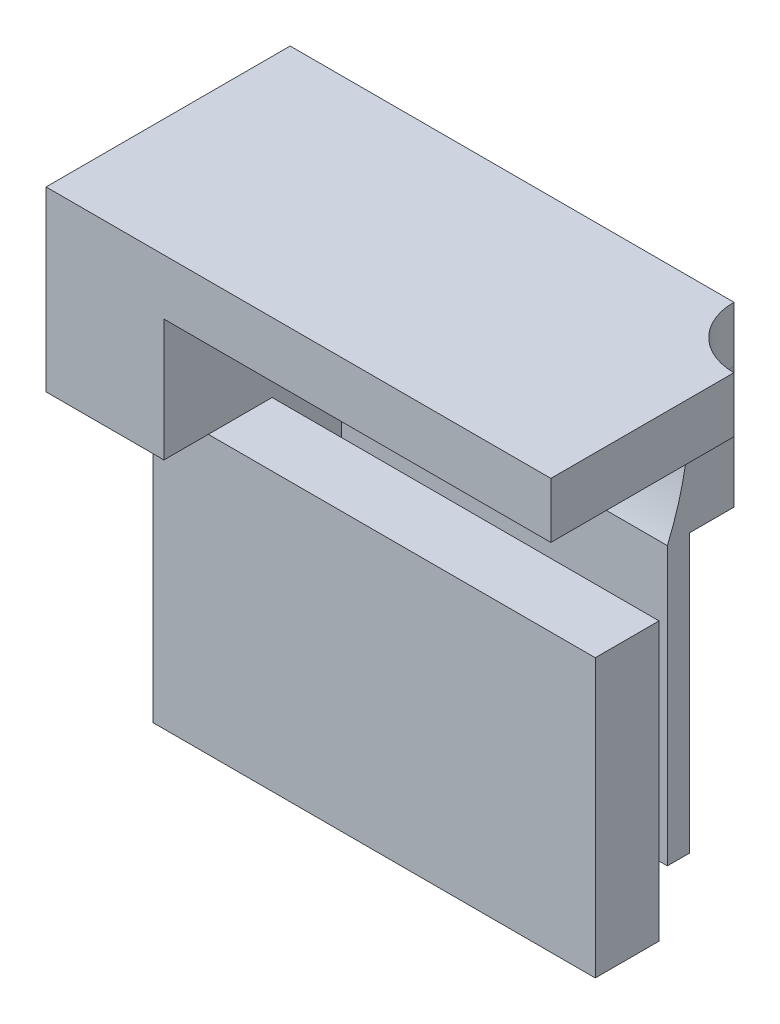
ISO-10303-21;
HEADER;
FILE_DESCRIPTION(('STEP AP214'),'2;1');
FILE_NAME('part.step','',(''),(''),'','','');
FILE_SCHEMA(('AUTOMOTIVE_DESIGN { 1 0 10303 214 1 1 1 1 }'));
ENDSEC;
DATA;
#1=APPLICATION_CONTEXT('core data for automotive mechanical design processes');
#2=APPLICATION_PROTOCOL_DEFINITION('international standard','automotive_design',2000,#1);
#3=PRODUCT_CONTEXT('',#1,'mechanical');
#4=PRODUCT('Part','Part','',(#3));
#5=PRODUCT_RELATED_PRODUCT_CATEGORY('part','',(#4));
#6=PRODUCT_DEFINITION_FORMATION('','',#4);
#7=PRODUCT_DEFINITION_CONTEXT('part definition',#1,'design');
#8=PRODUCT_DEFINITION('design','',#6,#7);
#9=PRODUCT_DEFINITION_SHAPE('','',#8);
#10=(LENGTH_UNIT() NAMED_UNIT(*) SI_UNIT(.MILLI.,.METRE.));
#11=(NAMED_UNIT(*) PLANE_ANGLE_UNIT() SI_UNIT($,.RADIAN.));
#12=(NAMED_UNIT(*) SI_UNIT($,.STERADIAN.) SOLID_ANGLE_UNIT());
#13=UNCERTAINTY_MEASURE_WITH_UNIT(LENGTH_MEASURE(1.E-05),#10,'distance_accuracy_value','');
#14=(GEOMETRIC_REPRESENTATION_CONTEXT(3) GLOBAL_UNCERTAINTY_ASSIGNED_CONTEXT((#13)) GLOBAL_UNIT_ASSIGNED_CONTEXT((#10,
#11,#12)) REPRESENTATION_CONTEXT('',''));
#15=CARTESIAN_POINT('',(0.,0.,0.));
#16=DIRECTION('',(0.,0.,1.));
#17=DIRECTION('',(1.,0.,0.));
#18=AXIS2_PLACEMENT_3D('',#15,#16,#17);
#19=CARTESIAN_POINT('',(-25.4088697452663,0.,-4.39999999999999));
#20=DIRECTION('',(0.,1.,0.));
#21=DIRECTION('',(0.,0.,1.));
#22=AXIS2_PLACEMENT_3D('',#19,#20,#21);
#23=PLANE('',#22);
#24=DIRECTION('',(0.,0.,1.));
#25=VECTOR('',#24,1.);
#26=CARTESIAN_POINT('',(-27.6088697452663,0.,0.));
#27=LINE('',#26,#25);
#28=CARTESIAN_POINT('',(-27.6088697452663,0.,-4.39999999999999));
#29=VERTEX_POINT('',#28);
#30=CARTESIAN_POINT('',(-27.6088697452663,0.,-2.79999999999999));
#31=VERTEX_POINT('',#30);
#32=EDGE_CURVE('E234',#29,#31,#27,.T.);
#33=ORIENTED_EDGE('',*,*,#32,.F.);
#34=CARTESIAN_POINT('',(-25.4088697452663,0.,-4.39999999999999));
#35=DIRECTION('',(0.,-1.,0.));
#36=DIRECTION('',(0.,0.,1.));
#37=AXIS2_PLACEMENT_3D('',#34,#35,#36);
#38=CIRCLE('',#37,2.20000000000001);
#39=CARTESIAN_POINT('',(-25.4088697452663,0.,-2.19999999999999));
#40=VERTEX_POINT('',#39);
#41=EDGE_CURVE('E261',#40,#29,#38,.T.);
#42=ORIENTED_EDGE('',*,*,#41,.F.);
#43=DIRECTION('',(0.,0.,-1.));
#44=VECTOR('',#43,1.);
#45=CARTESIAN_POINT('',(-25.4088697452663,0.,-2.19999999999999));
#46=LINE('',#45,#44);
#47=CARTESIAN_POINT('',(-25.4088697452663,0.,4.4));
#48=VERTEX_POINT('',#47);
#49=EDGE_CURVE('E271',#48,#40,#46,.T.);
#50=ORIENTED_EDGE('',*,*,#49,.F.);
#51=DIRECTION('',(1.,0.,0.));
#52=VECTOR('',#51,1.);
#53=CARTESIAN_POINT('',(-43.6088697452663,0.,4.4));
#54=LINE('',#53,#52);
#55=CARTESIAN_POINT('',(-39.3588697452663,0.,4.4));
#56=VERTEX_POINT('',#55);
#57=EDGE_CURVE('E256',#56,#48,#54,.T.);
#58=ORIENTED_EDGE('',*,*,#57,.F.);
#59=DIRECTION('',(0.,0.,1.));
#60=VECTOR('',#59,1.);
#61=CARTESIAN_POINT('',(-39.3588697452663,0.,0.));
#62=LINE('',#61,#60);
#63=CARTESIAN_POINT('',(-39.3588697452663,0.,-2.8));
#64=VERTEX_POINT('',#63);
#65=EDGE_CURVE('E243',#64,#56,#62,.T.);
#66=ORIENTED_EDGE('',*,*,#65,.F.);
#67=DIRECTION('',(-1.,0.,0.));
#68=VECTOR('',#67,1.);
#69=CARTESIAN_POINT('',(0.,0.,-2.79999999999999));
#70=LINE('',#69,#68);
#71=EDGE_CURVE('E230',#31,#64,#70,.T.);
#72=ORIENTED_EDGE('',*,*,#71,.F.);
#73=EDGE_LOOP('',(#33,#42,#50,#58,#66,#72));
#74=FACE_BOUND('',#73,.T.);
#75=ADVANCED_FACE('F39',(#74),#23,.F.);
#76=CARTESIAN_POINT('',(-43.6088697452663,2.,-4.39999999999999));
#77=DIRECTION('',(1.,0.,0.));
#78=DIRECTION('',(0.,0.,-1.));
#79=AXIS2_PLACEMENT_3D('',#76,#77,#78);
#80=PLANE('',#79);
#81=DIRECTION('',(0.,-1.,0.));
#82=VECTOR('',#81,1.);
#83=CARTESIAN_POINT('',(-43.6088697452663,2.,-4.39999999999999));
#84=LINE('',#83,#82);
#85=CARTESIAN_POINT('',(-43.6088697452663,2.,-4.39999999999999));
#86=VERTEX_POINT('',#85);
#87=CARTESIAN_POINT('',(-43.6088697452663,-4.4,-4.39999999999999));
#88=VERTEX_POINT('',#87);
#89=EDGE_CURVE('E269',#86,#88,#84,.T.);
#90=ORIENTED_EDGE('',*,*,#89,.T.);
#91=DIRECTION('',(0.,0.,-1.));
#92=VECTOR('',#91,1.);
#93=CARTESIAN_POINT('',(-43.6088697452663,-4.4,0.));
#94=LINE('',#93,#92);
#95=CARTESIAN_POINT('',(-43.6088697452663,-4.4,4.4));
#96=VERTEX_POINT('',#95);
#97=EDGE_CURVE('E238',#96,#88,#94,.T.);
#98=ORIENTED_EDGE('',*,*,#97,.F.);
#99=DIRECTION('',(0.,-1.,0.));
#100=VECTOR('',#99,1.);
#101=CARTESIAN_POINT('',(-43.6088697452663,2.,4.4));
#102=LINE('',#101,#100);
#103=CARTESIAN_POINT('',(-43.6088697452663,2.,4.4));
#104=VERTEX_POINT('',#103);
#105=EDGE_CURVE('E285',#104,#96,#102,.T.);
#106=ORIENTED_EDGE('',*,*,#105,.F.);
#107=DIRECTION('',(0.,0.,1.));
#108=VECTOR('',#107,1.);
#109=CARTESIAN_POINT('',(-43.6088697452663,2.,-4.39999999999999));
#110=LINE('',#109,#108);
#111=EDGE_CURVE('E257',#86,#104,#110,.T.);
#112=ORIENTED_EDGE('',*,*,#111,.F.);
#113=EDGE_LOOP('',(#90,#98,#106,#112));
#114=FACE_BOUND('',#113,.T.);
#115=ADVANCED_FACE('F336',(#114),#80,.F.);
#116=CARTESIAN_POINT('',(-43.6088697452663,2.,4.4));
#117=DIRECTION('',(0.,0.,-1.));
#118=DIRECTION('',(-1.,0.,0.));
#119=AXIS2_PLACEMENT_3D('',#116,#117,#118);
#120=PLANE('',#119);
#121=ORIENTED_EDGE('',*,*,#105,.T.);
#122=DIRECTION('',(-1.,0.,0.));
#123=VECTOR('',#122,1.);
#124=CARTESIAN_POINT('',(0.,-4.4,4.4));
#125=LINE('',#124,#123);
#126=CARTESIAN_POINT('',(-39.3588697452663,-4.4,4.4));
#127=VERTEX_POINT('',#126);
#128=EDGE_CURVE('E235',#127,#96,#125,.T.);
#129=ORIENTED_EDGE('',*,*,#128,.F.);
#130=DIRECTION('',(0.,1.,0.));
#131=VECTOR('',#130,1.);
#132=CARTESIAN_POINT('',(-39.3588697452663,-4.4,4.4));
#133=LINE('',#132,#131);
#134=EDGE_CURVE('E251',#127,#56,#133,.T.);
#135=ORIENTED_EDGE('',*,*,#134,.T.);
#136=ORIENTED_EDGE('',*,*,#57,.T.);
#137=DIRECTION('',(0.,-1.,0.));
#138=VECTOR('',#137,1.);
#139=CARTESIAN_POINT('',(-25.4088697452663,2.,4.4));
#140=LINE('',#139,#138);
#141=CARTESIAN_POINT('',(-25.4088697452663,2.,4.4));
#142=VERTEX_POINT('',#141);
#143=EDGE_CURVE('E282',#142,#48,#140,.T.);
#144=ORIENTED_EDGE('',*,*,#143,.F.);
#145=DIRECTION('',(1.,0.,0.));
#146=VECTOR('',#145,1.);
#147=CARTESIAN_POINT('',(-43.6088697452663,2.,4.4));
#148=LINE('',#147,#146);
#149=EDGE_CURVE('E260',#104,#142,#148,.T.);
#150=ORIENTED_EDGE('',*,*,#149,.F.);
#151=EDGE_LOOP('',(#121,#129,#135,#136,#144,#150));
#152=FACE_BOUND('',#151,.T.);
#153=ADVANCED_FACE('F331',(#152),#120,.F.);
#154=CARTESIAN_POINT('',(-25.4088697452663,2.,-2.19999999999999));
#155=DIRECTION('',(-1.,0.,0.));
#156=DIRECTION('',(0.,0.,1.));
#157=AXIS2_PLACEMENT_3D('',#154,#155,#156);
#158=PLANE('',#157);
#159=ORIENTED_EDGE('',*,*,#49,.T.);
#160=DIRECTION('',(0.,-1.,0.));
#161=VECTOR('',#160,1.);
#162=CARTESIAN_POINT('',(-25.4088697452663,2.,-2.19999999999999));
#163=LINE('',#162,#161);
#164=CARTESIAN_POINT('',(-25.4088697452663,2.,-2.19999999999999));
#165=VERTEX_POINT('',#164);
#166=EDGE_CURVE('E279',#165,#40,#163,.T.);
#167=ORIENTED_EDGE('',*,*,#166,.F.);
#168=DIRECTION('',(0.,0.,-1.));
#169=VECTOR('',#168,1.);
#170=CARTESIAN_POINT('',(-25.4088697452663,2.,-2.19999999999999));
#171=LINE('',#170,#169);
#172=EDGE_CURVE('E263',#142,#165,#171,.T.);
#173=ORIENTED_EDGE('',*,*,#172,.F.);
#174=ORIENTED_EDGE('',*,*,#143,.T.);
#175=EDGE_LOOP('',(#159,#167,#173,#174));
#176=FACE_BOUND('',#175,.T.);
#177=ADVANCED_FACE('F348',(#176),#158,.F.);
#178=CARTESIAN_POINT('',(-25.4088697452663,2.,-4.39999999999999));
#179=DIRECTION('',(0.,-1.,0.));
#180=DIRECTION('',(0.,0.,-1.));
#181=AXIS2_PLACEMENT_3D('',#178,#179,#180);
#182=CYLINDRICAL_SURFACE('',#181,2.20000000000001);
#183=ORIENTED_EDGE('',*,*,#41,.T.);
#184=DIRECTION('',(0.,-1.,0.));
#185=VECTOR('',#184,1.);
#186=CARTESIAN_POINT('',(-27.6088697452663,2.,-4.39999999999999));
#187=LINE('',#186,#185);
#188=CARTESIAN_POINT('',(-27.6088697452663,2.,-4.39999999999999));
#189=VERTEX_POINT('',#188);
#190=EDGE_CURVE('E276',#189,#29,#187,.T.);
#191=ORIENTED_EDGE('',*,*,#190,.F.);
#192=CARTESIAN_POINT('',(-25.4088697452663,2.,-4.39999999999999));
#193=DIRECTION('',(0.,-1.,0.));
#194=DIRECTION('',(0.,0.,1.));
#195=AXIS2_PLACEMENT_3D('',#192,#193,#194);
#196=CIRCLE('',#195,2.20000000000001);
#197=EDGE_CURVE('E265',#165,#189,#196,.T.);
#198=ORIENTED_EDGE('',*,*,#197,.F.);
#199=ORIENTED_EDGE('',*,*,#166,.T.);
#200=EDGE_LOOP('',(#183,#191,#198,#199));
#201=FACE_BOUND('',#200,.T.);
#202=ADVANCED_FACE('F345',(#201),#182,.F.);
#203=CARTESIAN_POINT('',(-43.6088697452663,2.,-4.39999999999999));
#204=DIRECTION('',(0.,0.,1.));
#205=DIRECTION('',(1.,0.,0.));
#206=AXIS2_PLACEMENT_3D('',#203,#204,#205);
#207=PLANE('',#206);
#208=ORIENTED_EDGE('',*,*,#190,.T.);
#209=DIRECTION('',(0.,1.,0.));
#210=VECTOR('',#209,1.);
#211=CARTESIAN_POINT('',(-27.6088697452663,-4.4,-4.39999999999999));
#212=LINE('',#211,#210);
#213=CARTESIAN_POINT('',(-27.6088697452663,-4.4,-4.39999999999999));
#214=VERTEX_POINT('',#213);
#215=EDGE_CURVE('E249',#214,#29,#212,.T.);
#216=ORIENTED_EDGE('',*,*,#215,.F.);
#217=DIRECTION('',(1.,0.,0.));
#218=VECTOR('',#217,1.);
#219=CARTESIAN_POINT('',(0.,-4.4,-4.39999999999999));
#220=LINE('',#219,#218);
#221=EDGE_CURVE('E164',#88,#214,#220,.T.);
#222=ORIENTED_EDGE('',*,*,#221,.F.);
#223=ORIENTED_EDGE('',*,*,#89,.F.);
#224=DIRECTION('',(-1.,0.,0.));
#225=VECTOR('',#224,1.);
#226=CARTESIAN_POINT('',(-43.6088697452663,2.,-4.39999999999999));
#227=LINE('',#226,#225);
#228=EDGE_CURVE('E267',#189,#86,#227,.T.);
#229=ORIENTED_EDGE('',*,*,#228,.F.);
#230=EDGE_LOOP('',(#208,#216,#222,#223,#229));
#231=FACE_BOUND('',#230,.T.);
#232=ADVANCED_FACE('F341',(#231),#207,.F.);
#233=CARTESIAN_POINT('',(-25.4088697452663,2.,-4.39999999999999));
#234=DIRECTION('',(0.,1.,0.));
#235=DIRECTION('',(0.,0.,1.));
#236=AXIS2_PLACEMENT_3D('',#233,#234,#235);
#237=PLANE('',#236);
#238=ORIENTED_EDGE('',*,*,#111,.T.);
#239=ORIENTED_EDGE('',*,*,#149,.T.);
#240=ORIENTED_EDGE('',*,*,#172,.T.);
#241=ORIENTED_EDGE('',*,*,#197,.T.);
#242=ORIENTED_EDGE('',*,*,#228,.T.);
#243=EDGE_LOOP('',(#238,#239,#240,#241,#242));
#244=FACE_BOUND('',#243,.T.);
#245=ADVANCED_FACE('F351',(#244),#237,.T.);
#246=CARTESIAN_POINT('',(0.,-4.4,-2.79999999999999));
#247=DIRECTION('',(0.,0.,-1.));
#248=DIRECTION('',(-1.,0.,0.));
#249=AXIS2_PLACEMENT_3D('',#246,#247,#248);
#250=PLANE('',#249);
#251=DIRECTION('',(0.,1.,0.));
#252=VECTOR('',#251,1.);
#253=CARTESIAN_POINT('',(-39.3588697452663,-4.4,-2.8));
#254=LINE('',#253,#252);
#255=CARTESIAN_POINT('',(-39.3588697452663,-0.480816411546927,-2.8));
#256=VERTEX_POINT('',#255);
#257=EDGE_CURVE('E254',#256,#64,#254,.T.);
#258=ORIENTED_EDGE('',*,*,#257,.F.);
#259=DIRECTION('',(1.,0.,0.));
#260=VECTOR('',#259,1.);
#261=CARTESIAN_POINT('',(0.,-0.480816411546927,-2.79999999999999));
#262=LINE('',#261,#260);
#263=CARTESIAN_POINT('',(-27.6088697452663,-0.480816411546927,-2.79999999999999));
#264=VERTEX_POINT('',#263);
#265=EDGE_CURVE('E47',#256,#264,#262,.T.);
#266=ORIENTED_EDGE('',*,*,#265,.T.);
#267=DIRECTION('',(0.,1.,0.));
#268=VECTOR('',#267,1.);
#269=CARTESIAN_POINT('',(-27.6088697452663,-4.4,-2.79999999999999));
#270=LINE('',#269,#268);
#271=EDGE_CURVE('E168',#264,#31,#270,.T.);
#272=ORIENTED_EDGE('',*,*,#271,.T.);
#273=ORIENTED_EDGE('',*,*,#71,.T.);
#274=EDGE_LOOP('',(#258,#266,#272,#273));
#275=FACE_BOUND('',#274,.T.);
#276=ADVANCED_FACE('F324',(#275),#250,.F.);
#277=CARTESIAN_POINT('',(-39.3588697452663,-4.4,0.));
#278=DIRECTION('',(-1.,0.,0.));
#279=DIRECTION('',(0.,0.,1.));
#280=AXIS2_PLACEMENT_3D('',#277,#278,#279);
#281=PLANE('',#280);
#282=DIRECTION('',(0.,1.,0.));
#283=VECTOR('',#282,1.);
#284=CARTESIAN_POINT('',(-39.3588697452663,-14.4,-2.));
#285=LINE('',#284,#283);
#286=CARTESIAN_POINT('',(-39.3588697452663,-14.4,-2.));
#287=VERTEX_POINT('',#286);
#288=CARTESIAN_POINT('',(-39.3588697452663,-4.4,-2.));
#289=VERTEX_POINT('',#288);
#290=EDGE_CURVE('E218',#287,#289,#285,.T.);
#291=ORIENTED_EDGE('',*,*,#290,.T.);
#292=CARTESIAN_POINT('',(-39.3588697452663,-0.480816411546927,7.20000000000001));
#293=DIRECTION('',(-1.,0.,0.));
#294=DIRECTION('',(0.,0.,1.));
#295=AXIS2_PLACEMENT_3D('',#292,#293,#294);
#296=CIRCLE('',#295,10.);
#297=EDGE_CURVE('E287',#289,#256,#296,.F.);
#298=ORIENTED_EDGE('',*,*,#297,.T.);
#299=ORIENTED_EDGE('',*,*,#257,.T.);
#300=ORIENTED_EDGE('',*,*,#65,.T.);
#301=ORIENTED_EDGE('',*,*,#134,.F.);
#302=DIRECTION('',(0.,0.,1.));
#303=VECTOR('',#302,1.);
#304=CARTESIAN_POINT('',(-39.3588697452663,-4.4,0.));
#305=LINE('',#304,#303);
#306=CARTESIAN_POINT('',(-39.3588697452663,-4.4,2.8));
#307=VERTEX_POINT('',#306);
#308=EDGE_CURVE('E231',#307,#127,#305,.T.);
#309=ORIENTED_EDGE('',*,*,#308,.F.);
#310=CARTESIAN_POINT('',(-39.3588697452663,-4.4,0.500000000000003));
#311=VERTEX_POINT('',#310);
#312=EDGE_CURVE('E233',#311,#307,#305,.T.);
#313=ORIENTED_EDGE('',*,*,#312,.F.);
#314=DIRECTION('',(0.,1.,0.));
#315=VECTOR('',#314,1.);
#316=CARTESIAN_POINT('',(-39.3588697452663,-14.4,0.500000000000003));
#317=LINE('',#316,#315);
#318=CARTESIAN_POINT('',(-39.3588697452663,-14.4,0.500000000000003));
#319=VERTEX_POINT('',#318);
#320=EDGE_CURVE('E215',#319,#311,#317,.T.);
#321=ORIENTED_EDGE('',*,*,#320,.F.);
#322=DIRECTION('',(0.,0.,1.));
#323=VECTOR('',#322,1.);
#324=CARTESIAN_POINT('',(-39.3588697452663,-14.4,-2.));
#325=LINE('',#324,#323);
#326=EDGE_CURVE('E196',#287,#319,#325,.T.);
#327=ORIENTED_EDGE('',*,*,#326,.F.);
#328=EDGE_LOOP('',(#291,#298,#299,#300,#301,#309,#313,#321,#327));
#329=FACE_BOUND('',#328,.T.);
#330=ADVANCED_FACE('F310',(#329),#281,.F.);
#331=CARTESIAN_POINT('',(-27.6088697452663,-4.4,0.));
#332=DIRECTION('',(-1.,0.,0.));
#333=DIRECTION('',(0.,0.,1.));
#334=AXIS2_PLACEMENT_3D('',#331,#332,#333);
#335=PLANE('',#334);
#336=DIRECTION('',(0.,0.,1.));
#337=VECTOR('',#336,1.);
#338=CARTESIAN_POINT('',(-27.6088697452663,-14.4,-2.79999999999999));
#339=LINE('',#338,#337);
#340=CARTESIAN_POINT('',(-27.6088697452663,-14.4,-2.79999999999999));
#341=VERTEX_POINT('',#340);
#342=CARTESIAN_POINT('',(-27.6088697452663,-14.4,-2.));
#343=VERTEX_POINT('',#342);
#344=EDGE_CURVE('E178',#341,#343,#339,.T.);
#345=ORIENTED_EDGE('',*,*,#344,.F.);
#346=DIRECTION('',(0.,-1.,0.));
#347=VECTOR('',#346,1.);
#348=CARTESIAN_POINT('',(-27.6088697452663,-4.4,-2.79999999999999));
#349=LINE('',#348,#347);
#350=CARTESIAN_POINT('',(-27.6088697452663,-4.4,-2.79999999999999));
#351=VERTEX_POINT('',#350);
#352=EDGE_CURVE('E54',#351,#341,#349,.T.);
#353=ORIENTED_EDGE('',*,*,#352,.F.);
#354=DIRECTION('',(0.,0.,1.));
#355=VECTOR('',#354,1.);
#356=CARTESIAN_POINT('',(-27.6088697452663,-4.4,0.));
#357=LINE('',#356,#355);
#358=EDGE_CURVE('E158',#214,#351,#357,.T.);
#359=ORIENTED_EDGE('',*,*,#358,.F.);
#360=ORIENTED_EDGE('',*,*,#215,.T.);
#361=ORIENTED_EDGE('',*,*,#32,.T.);
#362=ORIENTED_EDGE('',*,*,#271,.F.);
#363=CARTESIAN_POINT('',(-27.6088697452663,-0.480816411546927,7.20000000000001));
#364=DIRECTION('',(-1.,0.,0.));
#365=DIRECTION('',(0.,0.,1.));
#366=AXIS2_PLACEMENT_3D('',#363,#364,#365);
#367=CIRCLE('',#366,10.);
#368=CARTESIAN_POINT('',(-27.6088697452663,-4.4,-2.));
#369=VERTEX_POINT('',#368);
#370=EDGE_CURVE('E11',#264,#369,#367,.T.);
#371=ORIENTED_EDGE('',*,*,#370,.T.);
#372=DIRECTION('',(0.,1.,0.));
#373=VECTOR('',#372,1.);
#374=CARTESIAN_POINT('',(-27.6088697452663,-14.4,-2.));
#375=LINE('',#374,#373);
#376=EDGE_CURVE('E221',#343,#369,#375,.T.);
#377=ORIENTED_EDGE('',*,*,#376,.F.);
#378=EDGE_LOOP('',(#345,#353,#359,#360,#361,#362,#371,#377));
#379=FACE_BOUND('',#378,.T.);
#380=ADVANCED_FACE('F176',(#379),#335,.F.);
#381=CARTESIAN_POINT('',(0.,-4.4,0.));
#382=DIRECTION('',(0.,-1.,0.));
#383=DIRECTION('',(0.,0.,-1.));
#384=AXIS2_PLACEMENT_3D('',#381,#382,#383);
#385=PLANE('',#384);
#386=ORIENTED_EDGE('',*,*,#358,.T.);
#387=DIRECTION('',(-1.,0.,0.));
#388=VECTOR('',#387,1.);
#389=CARTESIAN_POINT('',(-27.6088697452663,-4.4,-2.79999999999999));
#390=LINE('',#389,#388);
#391=CARTESIAN_POINT('',(-41.3588697452663,-4.4,-2.79999999999999));
#392=VERTEX_POINT('',#391);
#393=EDGE_CURVE('E160',#351,#392,#390,.T.);
#394=ORIENTED_EDGE('',*,*,#393,.T.);
#395=DIRECTION('',(0.,0.,-1.));
#396=VECTOR('',#395,1.);
#397=CARTESIAN_POINT('',(-41.3588697452663,-4.4,-3.79999999999999));
#398=LINE('',#397,#396);
#399=CARTESIAN_POINT('',(-41.3588697452663,-4.4,2.8));
#400=VERTEX_POINT('',#399);
#401=EDGE_CURVE('E206',#400,#392,#398,.T.);
#402=ORIENTED_EDGE('',*,*,#401,.F.);
#403=DIRECTION('',(-1.,0.,0.));
#404=VECTOR('',#403,1.);
#405=CARTESIAN_POINT('',(-41.3588697452663,-4.4,2.8));
#406=LINE('',#405,#404);
#407=EDGE_CURVE('E207',#307,#400,#406,.T.);
#408=ORIENTED_EDGE('',*,*,#407,.F.);
#409=ORIENTED_EDGE('',*,*,#308,.T.);
#410=ORIENTED_EDGE('',*,*,#128,.T.);
#411=ORIENTED_EDGE('',*,*,#97,.T.);
#412=ORIENTED_EDGE('',*,*,#221,.T.);
#413=EDGE_LOOP('',(#386,#394,#402,#408,#409,#410,#411,#412));
#414=FACE_BOUND('',#413,.T.);
#415=ADVANCED_FACE('F159',(#414),#385,.T.);
#416=CARTESIAN_POINT('',(0.,-4.4,0.));
#417=DIRECTION('',(0.,-1.,0.));
#418=DIRECTION('',(0.,0.,-1.));
#419=AXIS2_PLACEMENT_3D('',#416,#417,#418);
#420=PLANE('',#419);
#421=DIRECTION('',(1.,0.,0.));
#422=VECTOR('',#421,1.);
#423=CARTESIAN_POINT('',(-39.3588697452663,-4.4,0.500000000000003));
#424=LINE('',#423,#422);
#425=CARTESIAN_POINT('',(-25.4088697452663,-4.4,0.500000000000003));
#426=VERTEX_POINT('',#425);
#427=EDGE_CURVE('E188',#311,#426,#424,.T.);
#428=ORIENTED_EDGE('',*,*,#427,.F.);
#429=ORIENTED_EDGE('',*,*,#312,.T.);
#430=CARTESIAN_POINT('',(-25.4088697452663,-4.4,2.8));
#431=VERTEX_POINT('',#430);
#432=EDGE_CURVE('E203',#431,#307,#406,.T.);
#433=ORIENTED_EDGE('',*,*,#432,.F.);
#434=DIRECTION('',(0.,0.,1.));
#435=VECTOR('',#434,1.);
#436=CARTESIAN_POINT('',(-25.4088697452663,-4.4,2.8));
#437=LINE('',#436,#435);
#438=EDGE_CURVE('E180',#426,#431,#437,.T.);
#439=ORIENTED_EDGE('',*,*,#438,.F.);
#440=EDGE_LOOP('',(#428,#429,#433,#439));
#441=FACE_BOUND('',#440,.T.);
#442=ADVANCED_FACE('F307',(#441),#420,.F.);
#443=CARTESIAN_POINT('',(-25.4088697452663,-14.4,2.8));
#444=DIRECTION('',(-1.,0.,0.));
#445=DIRECTION('',(0.,0.,1.));
#446=AXIS2_PLACEMENT_3D('',#443,#444,#445);
#447=PLANE('',#446);
#448=ORIENTED_EDGE('',*,*,#438,.T.);
#449=DIRECTION('',(0.,1.,0.));
#450=VECTOR('',#449,1.);
#451=CARTESIAN_POINT('',(-25.4088697452663,-14.4,2.8));
#452=LINE('',#451,#450);
#453=CARTESIAN_POINT('',(-25.4088697452663,-14.4,2.8));
#454=VERTEX_POINT('',#453);
#455=EDGE_CURVE('E227',#454,#431,#452,.T.);
#456=ORIENTED_EDGE('',*,*,#455,.F.);
#457=DIRECTION('',(0.,0.,1.));
#458=VECTOR('',#457,1.);
#459=CARTESIAN_POINT('',(-25.4088697452663,-14.4,2.8));
#460=LINE('',#459,#458);
#461=CARTESIAN_POINT('',(-25.4088697452663,-14.4,0.500000000000003));
#462=VERTEX_POINT('',#461);
#463=EDGE_CURVE('E184',#462,#454,#460,.T.);
#464=ORIENTED_EDGE('',*,*,#463,.F.);
#465=DIRECTION('',(0.,1.,0.));
#466=VECTOR('',#465,1.);
#467=CARTESIAN_POINT('',(-25.4088697452663,-14.4,0.500000000000003));
#468=LINE('',#467,#466);
#469=EDGE_CURVE('E200',#462,#426,#468,.T.);
#470=ORIENTED_EDGE('',*,*,#469,.T.);
#471=EDGE_LOOP('',(#448,#456,#464,#470));
#472=FACE_BOUND('',#471,.T.);
#473=ADVANCED_FACE('F303',(#472),#447,.F.);
#474=CARTESIAN_POINT('',(-41.3588697452663,-14.4,2.8));
#475=DIRECTION('',(0.,0.,-1.));
#476=DIRECTION('',(-1.,0.,0.));
#477=AXIS2_PLACEMENT_3D('',#474,#475,#476);
#478=PLANE('',#477);
#479=ORIENTED_EDGE('',*,*,#432,.T.);
#480=ORIENTED_EDGE('',*,*,#407,.T.);
#481=DIRECTION('',(0.,1.,0.));
#482=VECTOR('',#481,1.);
#483=CARTESIAN_POINT('',(-41.3588697452663,-14.4,2.8));
#484=LINE('',#483,#482);
#485=CARTESIAN_POINT('',(-41.3588697452663,-14.4,2.8));
#486=VERTEX_POINT('',#485);
#487=EDGE_CURVE('E224',#486,#400,#484,.T.);
#488=ORIENTED_EDGE('',*,*,#487,.F.);
#489=DIRECTION('',(-1.,0.,0.));
#490=VECTOR('',#489,1.);
#491=CARTESIAN_POINT('',(-41.3588697452663,-14.4,2.8));
#492=LINE('',#491,#490);
#493=EDGE_CURVE('E187',#454,#486,#492,.T.);
#494=ORIENTED_EDGE('',*,*,#493,.F.);
#495=ORIENTED_EDGE('',*,*,#455,.T.);
#496=EDGE_LOOP('',(#479,#480,#488,#494,#495));
#497=FACE_BOUND('',#496,.T.);
#498=ADVANCED_FACE('F292',(#497),#478,.F.);
#499=CARTESIAN_POINT('',(-41.3588697452663,-14.4,-3.79999999999999));
#500=DIRECTION('',(1.,0.,0.));
#501=DIRECTION('',(0.,0.,-1.));
#502=AXIS2_PLACEMENT_3D('',#499,#500,#501);
#503=PLANE('',#502);
#504=ORIENTED_EDGE('',*,*,#401,.T.);
#505=DIRECTION('',(0.,-1.,0.));
#506=VECTOR('',#505,1.);
#507=CARTESIAN_POINT('',(-41.3588697452663,-4.4,-2.79999999999999));
#508=LINE('',#507,#506);
#509=CARTESIAN_POINT('',(-41.3588697452663,-14.4,-2.79999999999999));
#510=VERTEX_POINT('',#509);
#511=EDGE_CURVE('E172',#392,#510,#508,.T.);
#512=ORIENTED_EDGE('',*,*,#511,.T.);
#513=DIRECTION('',(0.,0.,-1.));
#514=VECTOR('',#513,1.);
#515=CARTESIAN_POINT('',(-41.3588697452663,-14.4,2.8));
#516=LINE('',#515,#514);
#517=EDGE_CURVE('E190',#486,#510,#516,.T.);
#518=ORIENTED_EDGE('',*,*,#517,.F.);
#519=ORIENTED_EDGE('',*,*,#487,.T.);
#520=EDGE_LOOP('',(#504,#512,#518,#519));
#521=FACE_BOUND('',#520,.T.);
#522=ADVANCED_FACE('F296',(#521),#503,.F.);
#523=CARTESIAN_POINT('',(-27.6088697452663,-14.4,-2.));
#524=DIRECTION('',(0.,0.,-1.));
#525=DIRECTION('',(-1.,0.,0.));
#526=AXIS2_PLACEMENT_3D('',#523,#524,#525);
#527=PLANE('',#526);
#528=DIRECTION('',(-1.,0.,0.));
#529=VECTOR('',#528,1.);
#530=CARTESIAN_POINT('',(-27.6088697452663,-4.4,-2.));
#531=LINE('',#530,#529);
#532=EDGE_CURVE('E209',#369,#289,#531,.T.);
#533=ORIENTED_EDGE('',*,*,#532,.T.);
#534=ORIENTED_EDGE('',*,*,#290,.F.);
#535=DIRECTION('',(-1.,0.,0.));
#536=VECTOR('',#535,1.);
#537=CARTESIAN_POINT('',(-27.6088697452663,-14.4,-2.));
#538=LINE('',#537,#536);
#539=EDGE_CURVE('E194',#343,#287,#538,.T.);
#540=ORIENTED_EDGE('',*,*,#539,.F.);
#541=ORIENTED_EDGE('',*,*,#376,.T.);
#542=EDGE_LOOP('',(#533,#534,#540,#541));
#543=FACE_BOUND('',#542,.T.);
#544=ADVANCED_FACE('F319',(#543),#527,.F.);
#545=CARTESIAN_POINT('',(-39.3588697452663,-14.4,0.500000000000003));
#546=DIRECTION('',(0.,0.,1.));
#547=DIRECTION('',(1.,0.,0.));
#548=AXIS2_PLACEMENT_3D('',#545,#546,#547);
#549=PLANE('',#548);
#550=ORIENTED_EDGE('',*,*,#427,.T.);
#551=ORIENTED_EDGE('',*,*,#469,.F.);
#552=DIRECTION('',(1.,0.,0.));
#553=VECTOR('',#552,1.);
#554=CARTESIAN_POINT('',(-39.3588697452663,-14.4,0.500000000000003));
#555=LINE('',#554,#553);
#556=EDGE_CURVE('E198',#319,#462,#555,.T.);
#557=ORIENTED_EDGE('',*,*,#556,.F.);
#558=ORIENTED_EDGE('',*,*,#320,.T.);
#559=EDGE_LOOP('',(#550,#551,#557,#558));
#560=FACE_BOUND('',#559,.T.);
#561=ADVANCED_FACE('F315',(#560),#549,.F.);
#562=CARTESIAN_POINT('',(0.,-14.4,0.));
#563=DIRECTION('',(0.,-1.,0.));
#564=DIRECTION('',(0.,0.,-1.));
#565=AXIS2_PLACEMENT_3D('',#562,#563,#564);
#566=PLANE('',#565);
#567=DIRECTION('',(-1.,0.,0.));
#568=VECTOR('',#567,1.);
#569=CARTESIAN_POINT('',(-27.6088697452663,-14.4,-2.79999999999999));
#570=LINE('',#569,#568);
#571=EDGE_CURVE('E173',#341,#510,#570,.T.);
#572=ORIENTED_EDGE('',*,*,#571,.F.);
#573=ORIENTED_EDGE('',*,*,#344,.T.);
#574=ORIENTED_EDGE('',*,*,#539,.T.);
#575=ORIENTED_EDGE('',*,*,#326,.T.);
#576=ORIENTED_EDGE('',*,*,#556,.T.);
#577=ORIENTED_EDGE('',*,*,#463,.T.);
#578=ORIENTED_EDGE('',*,*,#493,.T.);
#579=ORIENTED_EDGE('',*,*,#517,.T.);
#580=EDGE_LOOP('',(#572,#573,#574,#575,#576,#577,#578,#579));
#581=FACE_BOUND('',#580,.T.);
#582=ADVANCED_FACE('F298',(#581),#566,.T.);
#583=CARTESIAN_POINT('',(0.,-0.480816411546927,7.20000000000001));
#584=DIRECTION('',(1.,0.,0.));
#585=DIRECTION('',(0.,0.,-1.));
#586=AXIS2_PLACEMENT_3D('',#583,#584,#585);
#587=CYLINDRICAL_SURFACE('',#586,10.);
#588=ORIENTED_EDGE('',*,*,#370,.F.);
#589=ORIENTED_EDGE('',*,*,#265,.F.);
#590=ORIENTED_EDGE('',*,*,#297,.F.);
#591=ORIENTED_EDGE('',*,*,#532,.F.);
#592=EDGE_LOOP('',(#588,#589,#590,#591));
#593=FACE_BOUND('',#592,.T.);
#594=ADVANCED_FACE('F41',(#593),#587,.F.);
#595=CARTESIAN_POINT('',(-27.6088697452663,-4.4,-2.79999999999999));
#596=DIRECTION('',(0.,0.,1.));
#597=DIRECTION('',(1.,0.,0.));
#598=AXIS2_PLACEMENT_3D('',#595,#596,#597);
#599=PLANE('',#598);
#600=ORIENTED_EDGE('',*,*,#571,.T.);
#601=ORIENTED_EDGE('',*,*,#511,.F.);
#602=ORIENTED_EDGE('',*,*,#393,.F.);
#603=ORIENTED_EDGE('',*,*,#352,.T.);
#604=EDGE_LOOP('',(#600,#601,#602,#603));
#605=FACE_BOUND('',#604,.T.);
#606=ADVANCED_FACE('F170',(#605),#599,.F.);
#607=CLOSED_SHELL('',(#75,#115,#153,#177,#202,#232,#245,#276,#330,#380,#415,#442,#473,#498,#522,
#544,#561,#582,#594,#606));
#608=MANIFOLD_SOLID_BREP('B2',#607);
#609=ADVANCED_BREP_SHAPE_REPRESENTATION('',(#18,#608),#14);
#610=SHAPE_DEFINITION_REPRESENTATION(#9,#609);
ENDSEC;
END-ISO-10303-21;
